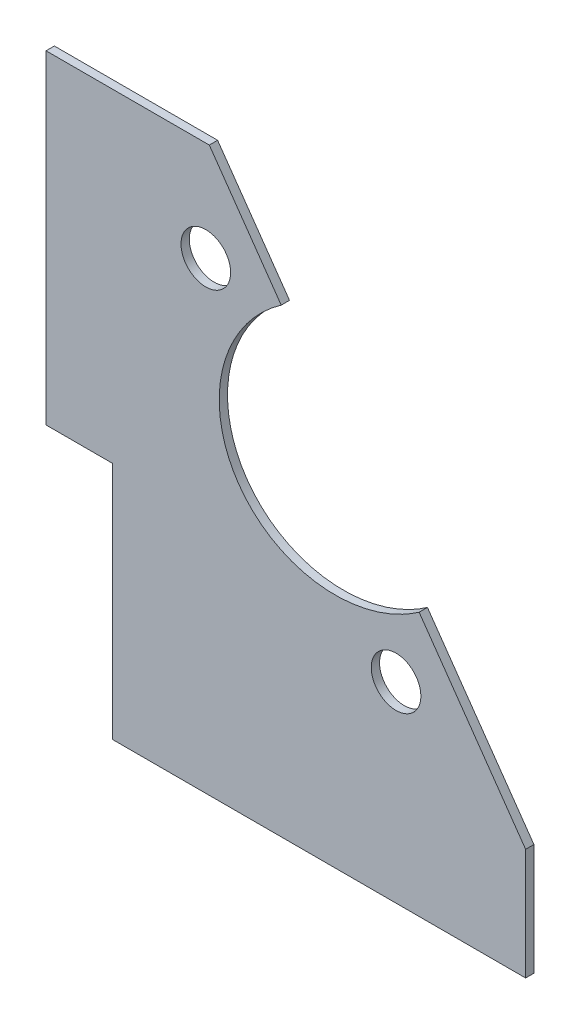
ISO-10303-21;
HEADER;
FILE_DESCRIPTION(('STEP AP214'),'2;1');
FILE_NAME('part.step','',(''),(''),'','','');
FILE_SCHEMA(('AUTOMOTIVE_DESIGN { 1 0 10303 214 1 1 1 1 }'));
ENDSEC;
DATA;
#1=APPLICATION_CONTEXT('core data for automotive mechanical design processes');
#2=APPLICATION_PROTOCOL_DEFINITION('international standard','automotive_design',2000,#1);
#3=PRODUCT_CONTEXT('',#1,'mechanical');
#4=PRODUCT('Part','Part','',(#3));
#5=PRODUCT_RELATED_PRODUCT_CATEGORY('part','',(#4));
#6=PRODUCT_DEFINITION_FORMATION('','',#4);
#7=PRODUCT_DEFINITION_CONTEXT('part definition',#1,'design');
#8=PRODUCT_DEFINITION('design','',#6,#7);
#9=PRODUCT_DEFINITION_SHAPE('','',#8);
#10=(LENGTH_UNIT() NAMED_UNIT(*) SI_UNIT(.MILLI.,.METRE.));
#11=(NAMED_UNIT(*) PLANE_ANGLE_UNIT() SI_UNIT($,.RADIAN.));
#12=(NAMED_UNIT(*) SI_UNIT($,.STERADIAN.) SOLID_ANGLE_UNIT());
#13=UNCERTAINTY_MEASURE_WITH_UNIT(LENGTH_MEASURE(1.E-05),#10,'distance_accuracy_value','');
#14=(GEOMETRIC_REPRESENTATION_CONTEXT(3) GLOBAL_UNCERTAINTY_ASSIGNED_CONTEXT((#13)) GLOBAL_UNIT_ASSIGNED_CONTEXT((#10,
#11,#12)) REPRESENTATION_CONTEXT('',''));
#15=CARTESIAN_POINT('',(0.,0.,0.));
#16=DIRECTION('',(0.,0.,1.));
#17=DIRECTION('',(1.,0.,0.));
#18=AXIS2_PLACEMENT_3D('',#15,#16,#17);
#19=CARTESIAN_POINT('',(0.,0.,1.5875));
#20=DIRECTION('',(1.,0.,0.));
#21=DIRECTION('',(0.,1.,0.));
#22=AXIS2_PLACEMENT_3D('',#19,#20,#21);
#23=PLANE('',#22);
#24=DIRECTION('',(0.,0.,1.));
#25=VECTOR('',#24,1.);
#26=CARTESIAN_POINT('',(0.,33.,0.));
#27=LINE('',#26,#25);
#28=CARTESIAN_POINT('',(0.,33.,0.));
#29=VERTEX_POINT('',#28);
#30=CARTESIAN_POINT('',(0.,33.,1.5875));
#31=VERTEX_POINT('',#30);
#32=EDGE_CURVE('E64',#29,#31,#27,.T.);
#33=ORIENTED_EDGE('',*,*,#32,.F.);
#34=DIRECTION('',(0.,-1.,0.));
#35=VECTOR('',#34,1.);
#36=CARTESIAN_POINT('',(0.,0.,0.));
#37=LINE('',#36,#35);
#38=CARTESIAN_POINT('',(0.,-12.75,0.));
#39=VERTEX_POINT('',#38);
#40=EDGE_CURVE('E228',#29,#39,#37,.T.);
#41=ORIENTED_EDGE('',*,*,#40,.T.);
#42=DIRECTION('',(0.,0.,-1.));
#43=VECTOR('',#42,1.);
#44=CARTESIAN_POINT('',(0.,-12.75,1.58749999999999));
#45=LINE('',#44,#43);
#46=CARTESIAN_POINT('',(0.,-12.75,1.58749999999999));
#47=VERTEX_POINT('',#46);
#48=EDGE_CURVE('E142',#47,#39,#45,.T.);
#49=ORIENTED_EDGE('',*,*,#48,.F.);
#50=DIRECTION('',(0.,-1.,0.));
#51=VECTOR('',#50,1.);
#52=CARTESIAN_POINT('',(0.,0.,1.5875));
#53=LINE('',#52,#51);
#54=EDGE_CURVE('E137',#31,#47,#53,.T.);
#55=ORIENTED_EDGE('',*,*,#54,.F.);
#56=EDGE_LOOP('',(#33,#41,#49,#55));
#57=FACE_BOUND('',#56,.T.);
#58=ADVANCED_FACE('F47',(#57),#23,.F.);
#59=CARTESIAN_POINT('',(45.430698847832,56.5108185686468,1.5875));
#60=DIRECTION('',(0.,0.,1.));
#61=DIRECTION('',(0.819152044288989,0.57357643635105,0.));
#62=AXIS2_PLACEMENT_3D('',#59,#60,#61);
#63=ELLIPSE('',#62,26.,23.);
#64=DIRECTION('',(0.,0.,-1.));
#65=VECTOR('',#64,1.);
#66=SURFACE_OF_LINEAR_EXTRUSION('',#63,#65);
#67=CARTESIAN_POINT('',(45.430698847832,56.5108185686468,0.));
#68=DIRECTION('',(0.,0.,1.));
#69=DIRECTION('',(0.819152044288989,0.57357643635105,0.));
#70=AXIS2_PLACEMENT_3D('',#67,#68,#69);
#71=ELLIPSE('',#70,26.,23.);
#72=CARTESIAN_POINT('',(32.2384408117578,75.3513155872935,0.));
#73=VERTEX_POINT('',#72);
#74=CARTESIAN_POINT('',(58.622956883906,37.67032155,0.));
#75=VERTEX_POINT('',#74);
#76=EDGE_CURVE('E195',#73,#75,#71,.T.);
#77=ORIENTED_EDGE('',*,*,#76,.F.);
#78=DIRECTION('',(0.,0.,-1.));
#79=VECTOR('',#78,1.);
#80=CARTESIAN_POINT('',(32.2384408117578,75.3513155872935,1.5875));
#81=LINE('',#80,#79);
#82=CARTESIAN_POINT('',(32.2384408117578,75.3513155872935,1.5875));
#83=VERTEX_POINT('',#82);
#84=EDGE_CURVE('E11',#83,#73,#81,.T.);
#85=ORIENTED_EDGE('',*,*,#84,.F.);
#86=CARTESIAN_POINT('',(58.622956883906,37.67032155,1.5875));
#87=VERTEX_POINT('',#86);
#88=EDGE_CURVE('E206',#83,#87,#63,.T.);
#89=ORIENTED_EDGE('',*,*,#88,.T.);
#90=DIRECTION('',(0.,0.,-1.));
#91=VECTOR('',#90,1.);
#92=CARTESIAN_POINT('',(58.622956883906,37.67032155,1.5875));
#93=LINE('',#92,#91);
#94=EDGE_CURVE('E57',#87,#75,#93,.T.);
#95=ORIENTED_EDGE('',*,*,#94,.T.);
#96=EDGE_LOOP('',(#77,#85,#89,#95));
#97=FACE_BOUND('',#96,.T.);
#98=ADVANCED_FACE('F49',(#97),#66,.T.);
#99=CARTESIAN_POINT('',(57.0358560913405,39.9369363834013,1.5875));
#100=DIRECTION('',(-0.819152044288989,-0.57357643635105,0.));
#101=DIRECTION('',(0.57357643635105,-0.819152044288989,0.));
#102=AXIS2_PLACEMENT_3D('',#99,#100,#101);
#103=PLANE('',#102);
#104=DIRECTION('',(-0.57357643635105,0.819152044288989,0.));
#105=VECTOR('',#104,1.);
#106=CARTESIAN_POINT('',(57.0358560913405,39.9369363834013,0.));
#107=LINE('',#106,#105);
#108=CARTESIAN_POINT('',(18.4802838700769,95.,0.));
#109=VERTEX_POINT('',#108);
#110=EDGE_CURVE('E224',#73,#109,#107,.T.);
#111=ORIENTED_EDGE('',*,*,#110,.T.);
#112=DIRECTION('',(0.,0.,1.));
#113=VECTOR('',#112,1.);
#114=CARTESIAN_POINT('',(18.4802838700769,95.,0.));
#115=LINE('',#114,#113);
#116=CARTESIAN_POINT('',(18.4802838700769,95.,1.5875));
#117=VERTEX_POINT('',#116);
#118=EDGE_CURVE('E72',#109,#117,#115,.T.);
#119=ORIENTED_EDGE('',*,*,#118,.T.);
#120=DIRECTION('',(-0.57357643635105,0.819152044288989,0.));
#121=VECTOR('',#120,1.);
#122=CARTESIAN_POINT('',(57.0358560913405,39.9369363834013,1.5875));
#123=LINE('',#122,#121);
#124=EDGE_CURVE('E211',#83,#117,#123,.T.);
#125=ORIENTED_EDGE('',*,*,#124,.F.);
#126=ORIENTED_EDGE('',*,*,#84,.T.);
#127=EDGE_LOOP('',(#111,#119,#125,#126));
#128=FACE_BOUND('',#127,.T.);
#129=ADVANCED_FACE('F245',(#128),#103,.F.);
#130=CARTESIAN_POINT('',(57.0358560913405,39.9369363834013,1.5875));
#131=DIRECTION('',(-0.819152044288989,-0.57357643635105,0.));
#132=DIRECTION('',(0.57357643635105,-0.819152044288989,0.));
#133=AXIS2_PLACEMENT_3D('',#130,#131,#132);
#134=PLANE('',#133);
#135=DIRECTION('',(-0.57357643635105,0.819152044288989,0.));
#136=VECTOR('',#135,1.);
#137=CARTESIAN_POINT('',(57.0358560913405,39.9369363834013,1.5875));
#138=LINE('',#137,#136);
#139=CARTESIAN_POINT('',(79.,8.5688880404526,1.5875));
#140=VERTEX_POINT('',#139);
#141=EDGE_CURVE('E218',#140,#87,#138,.T.);
#142=ORIENTED_EDGE('',*,*,#141,.F.);
#143=DIRECTION('',(0.,0.,1.));
#144=VECTOR('',#143,1.);
#145=CARTESIAN_POINT('',(79.,8.5688880404526,0.));
#146=LINE('',#145,#144);
#147=CARTESIAN_POINT('',(79.,8.5688880404526,0.));
#148=VERTEX_POINT('',#147);
#149=EDGE_CURVE('E125',#148,#140,#146,.T.);
#150=ORIENTED_EDGE('',*,*,#149,.F.);
#151=DIRECTION('',(-0.57357643635105,0.819152044288989,0.));
#152=VECTOR('',#151,1.);
#153=CARTESIAN_POINT('',(57.0358560913405,39.9369363834013,0.));
#154=LINE('',#153,#152);
#155=EDGE_CURVE('E212',#148,#75,#154,.T.);
#156=ORIENTED_EDGE('',*,*,#155,.T.);
#157=ORIENTED_EDGE('',*,*,#94,.F.);
#158=EDGE_LOOP('',(#142,#150,#156,#157));
#159=FACE_BOUND('',#158,.T.);
#160=ADVANCED_FACE('F247',(#159),#134,.F.);
#161=CARTESIAN_POINT('',(0.,0.,1.5875));
#162=DIRECTION('',(0.,0.,1.));
#163=DIRECTION('',(1.,0.,0.));
#164=AXIS2_PLACEMENT_3D('',#161,#162,#163);
#165=PLANE('',#164);
#166=DIRECTION('',(0.,-1.,0.));
#167=VECTOR('',#166,1.);
#168=CARTESIAN_POINT('',(79.,8.5688880404526,1.5875));
#169=LINE('',#168,#167);
#170=CARTESIAN_POINT('',(79.,-12.75,1.5875));
#171=VERTEX_POINT('',#170);
#172=EDGE_CURVE('E119',#140,#171,#169,.T.);
#173=ORIENTED_EDGE('',*,*,#172,.F.);
#174=ORIENTED_EDGE('',*,*,#141,.T.);
#175=ORIENTED_EDGE('',*,*,#88,.F.);
#176=ORIENTED_EDGE('',*,*,#124,.T.);
#177=DIRECTION('',(1.,0.,0.));
#178=VECTOR('',#177,1.);
#179=CARTESIAN_POINT('',(0.,95.,1.5875));
#180=LINE('',#179,#178);
#181=CARTESIAN_POINT('',(-12.75,95.,1.5875));
#182=VERTEX_POINT('',#181);
#183=EDGE_CURVE('E130',#182,#117,#180,.T.);
#184=ORIENTED_EDGE('',*,*,#183,.F.);
#185=DIRECTION('',(0.,1.,0.));
#186=VECTOR('',#185,1.);
#187=CARTESIAN_POINT('',(-12.75,95.,1.5875));
#188=LINE('',#187,#186);
#189=CARTESIAN_POINT('',(-12.75,33.,1.5875));
#190=VERTEX_POINT('',#189);
#191=EDGE_CURVE('E162',#190,#182,#188,.T.);
#192=ORIENTED_EDGE('',*,*,#191,.F.);
#193=DIRECTION('',(1.,0.,0.));
#194=VECTOR('',#193,1.);
#195=CARTESIAN_POINT('',(-12.75,33.,1.5875));
#196=LINE('',#195,#194);
#197=EDGE_CURVE('E170',#190,#31,#196,.T.);
#198=ORIENTED_EDGE('',*,*,#197,.T.);
#199=ORIENTED_EDGE('',*,*,#54,.T.);
#200=DIRECTION('',(-1.,0.,0.));
#201=VECTOR('',#200,1.);
#202=CARTESIAN_POINT('',(79.,-12.75,1.5875));
#203=LINE('',#202,#201);
#204=EDGE_CURVE('E133',#171,#47,#203,.T.);
#205=ORIENTED_EDGE('',*,*,#204,.F.);
#206=EDGE_LOOP('',(#173,#174,#175,#176,#184,#192,#198,#199,#205));
#207=FACE_BOUND('',#206,.T.);
#208=CARTESIAN_POINT('',(17.8137378952715,75.9022881556779,1.5875));
#209=DIRECTION('',(0.,0.,1.));
#210=DIRECTION('',(1.,0.,0.));
#211=AXIS2_PLACEMENT_3D('',#208,#209,#210);
#212=CIRCLE('',#211,4.75000000000001);
#213=CARTESIAN_POINT('',(22.5637378952715,75.9022881556779,1.5875));
#214=VERTEX_POINT('',#213);
#215=EDGE_CURVE('E196',#214,#214,#212,.T.);
#216=ORIENTED_EDGE('',*,*,#215,.F.);
#217=EDGE_LOOP('',(#216));
#218=FACE_BOUND('',#217,.T.);
#219=CARTESIAN_POINT('',(54.2071627817456,23.9270909455415,1.5875));
#220=DIRECTION('',(0.,0.,1.));
#221=DIRECTION('',(1.,0.,0.));
#222=AXIS2_PLACEMENT_3D('',#219,#220,#221);
#223=CIRCLE('',#222,4.75000000000001);
#224=CARTESIAN_POINT('',(58.9571627817456,23.9270909455415,1.5875));
#225=VERTEX_POINT('',#224);
#226=EDGE_CURVE('E200',#225,#225,#223,.T.);
#227=ORIENTED_EDGE('',*,*,#226,.F.);
#228=EDGE_LOOP('',(#227));
#229=FACE_BOUND('',#228,.T.);
#230=ADVANCED_FACE('F134',(#207,#218,#229),#165,.T.);
#231=CARTESIAN_POINT('',(0.,0.,0.));
#232=DIRECTION('',(0.,0.,1.));
#233=DIRECTION('',(1.,0.,0.));
#234=AXIS2_PLACEMENT_3D('',#231,#232,#233);
#235=PLANE('',#234);
#236=CARTESIAN_POINT('',(17.8137378952715,75.9022881556779,0.));
#237=DIRECTION('',(0.,0.,1.));
#238=DIRECTION('',(1.,0.,0.));
#239=AXIS2_PLACEMENT_3D('',#236,#237,#238);
#240=CIRCLE('',#239,4.75000000000001);
#241=CARTESIAN_POINT('',(22.5637378952715,75.9022881556779,0.));
#242=VERTEX_POINT('',#241);
#243=EDGE_CURVE('E191',#242,#242,#240,.T.);
#244=ORIENTED_EDGE('',*,*,#243,.T.);
#245=EDGE_LOOP('',(#244));
#246=FACE_BOUND('',#245,.T.);
#247=CARTESIAN_POINT('',(54.2071627817456,23.9270909455415,0.));
#248=DIRECTION('',(0.,0.,1.));
#249=DIRECTION('',(1.,0.,0.));
#250=AXIS2_PLACEMENT_3D('',#247,#248,#249);
#251=CIRCLE('',#250,4.75000000000001);
#252=CARTESIAN_POINT('',(58.9571627817456,23.9270909455415,0.));
#253=VERTEX_POINT('',#252);
#254=EDGE_CURVE('E183',#253,#253,#251,.T.);
#255=ORIENTED_EDGE('',*,*,#254,.T.);
#256=EDGE_LOOP('',(#255));
#257=FACE_BOUND('',#256,.T.);
#258=ORIENTED_EDGE('',*,*,#155,.F.);
#259=DIRECTION('',(0.,-1.,0.));
#260=VECTOR('',#259,1.);
#261=CARTESIAN_POINT('',(79.,8.5688880404526,0.));
#262=LINE('',#261,#260);
#263=CARTESIAN_POINT('',(79.,-12.75,0.));
#264=VERTEX_POINT('',#263);
#265=EDGE_CURVE('E129',#148,#264,#262,.T.);
#266=ORIENTED_EDGE('',*,*,#265,.T.);
#267=DIRECTION('',(1.,0.,0.));
#268=VECTOR('',#267,1.);
#269=CARTESIAN_POINT('',(79.,-12.75,0.));
#270=LINE('',#269,#268);
#271=EDGE_CURVE('E147',#39,#264,#270,.T.);
#272=ORIENTED_EDGE('',*,*,#271,.F.);
#273=ORIENTED_EDGE('',*,*,#40,.F.);
#274=DIRECTION('',(1.,0.,0.));
#275=VECTOR('',#274,1.);
#276=CARTESIAN_POINT('',(-12.75,33.,0.));
#277=LINE('',#276,#275);
#278=CARTESIAN_POINT('',(-12.75,33.,0.));
#279=VERTEX_POINT('',#278);
#280=EDGE_CURVE('E175',#279,#29,#277,.T.);
#281=ORIENTED_EDGE('',*,*,#280,.F.);
#282=DIRECTION('',(0.,-1.,0.));
#283=VECTOR('',#282,1.);
#284=CARTESIAN_POINT('',(-12.75,95.,0.));
#285=LINE('',#284,#283);
#286=CARTESIAN_POINT('',(-12.75,95.,0.));
#287=VERTEX_POINT('',#286);
#288=EDGE_CURVE('E155',#287,#279,#285,.T.);
#289=ORIENTED_EDGE('',*,*,#288,.F.);
#290=DIRECTION('',(1.,0.,0.));
#291=VECTOR('',#290,1.);
#292=CARTESIAN_POINT('',(0.,95.,0.));
#293=LINE('',#292,#291);
#294=EDGE_CURVE('E186',#287,#109,#293,.T.);
#295=ORIENTED_EDGE('',*,*,#294,.T.);
#296=ORIENTED_EDGE('',*,*,#110,.F.);
#297=ORIENTED_EDGE('',*,*,#76,.T.);
#298=EDGE_LOOP('',(#258,#266,#272,#273,#281,#289,#295,#296,#297));
#299=FACE_BOUND('',#298,.T.);
#300=ADVANCED_FACE('F242',(#246,#257,#299),#235,.F.);
#301=CARTESIAN_POINT('',(54.2071627817456,23.9270909455415,0.));
#302=DIRECTION('',(0.,0.,1.));
#303=DIRECTION('',(1.,0.,0.));
#304=AXIS2_PLACEMENT_3D('',#301,#302,#303);
#305=CYLINDRICAL_SURFACE('',#304,4.75000000000001);
#306=ORIENTED_EDGE('',*,*,#254,.F.);
#307=EDGE_LOOP('',(#306));
#308=FACE_BOUND('',#307,.T.);
#309=ORIENTED_EDGE('',*,*,#226,.T.);
#310=EDGE_LOOP('',(#309));
#311=FACE_BOUND('',#310,.T.);
#312=ADVANCED_FACE('F270',(#308,#311),#305,.F.);
#313=CARTESIAN_POINT('',(17.8137378952715,75.9022881556779,0.));
#314=DIRECTION('',(0.,0.,1.));
#315=DIRECTION('',(1.,0.,0.));
#316=AXIS2_PLACEMENT_3D('',#313,#314,#315);
#317=CYLINDRICAL_SURFACE('',#316,4.75000000000001);
#318=ORIENTED_EDGE('',*,*,#243,.F.);
#319=EDGE_LOOP('',(#318));
#320=FACE_BOUND('',#319,.T.);
#321=ORIENTED_EDGE('',*,*,#215,.T.);
#322=EDGE_LOOP('',(#321));
#323=FACE_BOUND('',#322,.T.);
#324=ADVANCED_FACE('F274',(#320,#323),#317,.F.);
#325=CARTESIAN_POINT('',(0.,95.,0.));
#326=DIRECTION('',(0.,-1.,0.));
#327=DIRECTION('',(1.,0.,0.));
#328=AXIS2_PLACEMENT_3D('',#325,#326,#327);
#329=PLANE('',#328);
#330=ORIENTED_EDGE('',*,*,#183,.T.);
#331=ORIENTED_EDGE('',*,*,#118,.F.);
#332=ORIENTED_EDGE('',*,*,#294,.F.);
#333=DIRECTION('',(0.,0.,-1.));
#334=VECTOR('',#333,1.);
#335=CARTESIAN_POINT('',(-12.75,95.,0.));
#336=LINE('',#335,#334);
#337=EDGE_CURVE('E166',#182,#287,#336,.T.);
#338=ORIENTED_EDGE('',*,*,#337,.F.);
#339=EDGE_LOOP('',(#330,#331,#332,#338));
#340=FACE_BOUND('',#339,.T.);
#341=ADVANCED_FACE('F283',(#340),#329,.F.);
#342=CARTESIAN_POINT('',(79.,8.5688880404526,0.));
#343=DIRECTION('',(-1.,0.,0.));
#344=DIRECTION('',(0.,0.,1.));
#345=AXIS2_PLACEMENT_3D('',#342,#343,#344);
#346=PLANE('',#345);
#347=ORIENTED_EDGE('',*,*,#172,.T.);
#348=DIRECTION('',(0.,0.,1.));
#349=VECTOR('',#348,1.);
#350=CARTESIAN_POINT('',(79.,-12.75,1.5875));
#351=LINE('',#350,#349);
#352=EDGE_CURVE('E123',#264,#171,#351,.T.);
#353=ORIENTED_EDGE('',*,*,#352,.F.);
#354=ORIENTED_EDGE('',*,*,#265,.F.);
#355=ORIENTED_EDGE('',*,*,#149,.T.);
#356=EDGE_LOOP('',(#347,#353,#354,#355));
#357=FACE_BOUND('',#356,.T.);
#358=ADVANCED_FACE('F121',(#357),#346,.F.);
#359=CARTESIAN_POINT('',(-12.75,33.,0.));
#360=DIRECTION('',(0.,1.,0.));
#361=DIRECTION('',(-1.,0.,0.));
#362=AXIS2_PLACEMENT_3D('',#359,#360,#361);
#363=PLANE('',#362);
#364=ORIENTED_EDGE('',*,*,#32,.T.);
#365=ORIENTED_EDGE('',*,*,#197,.F.);
#366=DIRECTION('',(0.,0.,1.));
#367=VECTOR('',#366,1.);
#368=CARTESIAN_POINT('',(-12.75,33.,0.));
#369=LINE('',#368,#367);
#370=EDGE_CURVE('E159',#279,#190,#369,.T.);
#371=ORIENTED_EDGE('',*,*,#370,.F.);
#372=ORIENTED_EDGE('',*,*,#280,.T.);
#373=EDGE_LOOP('',(#364,#365,#371,#372));
#374=FACE_BOUND('',#373,.T.);
#375=ADVANCED_FACE('F333',(#374),#363,.F.);
#376=CARTESIAN_POINT('',(-12.75,0.,0.));
#377=DIRECTION('',(-1.,0.,0.));
#378=DIRECTION('',(0.,-1.,0.));
#379=AXIS2_PLACEMENT_3D('',#376,#377,#378);
#380=PLANE('',#379);
#381=ORIENTED_EDGE('',*,*,#288,.T.);
#382=ORIENTED_EDGE('',*,*,#370,.T.);
#383=ORIENTED_EDGE('',*,*,#191,.T.);
#384=ORIENTED_EDGE('',*,*,#337,.T.);
#385=EDGE_LOOP('',(#381,#382,#383,#384));
#386=FACE_BOUND('',#385,.T.);
#387=ADVANCED_FACE('F338',(#386),#380,.T.);
#388=CARTESIAN_POINT('',(0.,-12.75,0.));
#389=DIRECTION('',(0.,1.,0.));
#390=DIRECTION('',(0.,0.,1.));
#391=AXIS2_PLACEMENT_3D('',#388,#389,#390);
#392=PLANE('',#391);
#393=ORIENTED_EDGE('',*,*,#352,.T.);
#394=ORIENTED_EDGE('',*,*,#204,.T.);
#395=ORIENTED_EDGE('',*,*,#48,.T.);
#396=ORIENTED_EDGE('',*,*,#271,.T.);
#397=EDGE_LOOP('',(#393,#394,#395,#396));
#398=FACE_BOUND('',#397,.T.);
#399=ADVANCED_FACE('F145',(#398),#392,.F.);
#400=CLOSED_SHELL('',(#58,#98,#129,#160,#230,#300,#312,#324,#341,#358,#375,#387,#399));
#401=MANIFOLD_SOLID_BREP('B2',#400);
#402=ADVANCED_BREP_SHAPE_REPRESENTATION('',(#18,#401),#14);
#403=SHAPE_DEFINITION_REPRESENTATION(#9,#402);
ENDSEC;
END-ISO-10303-21;
